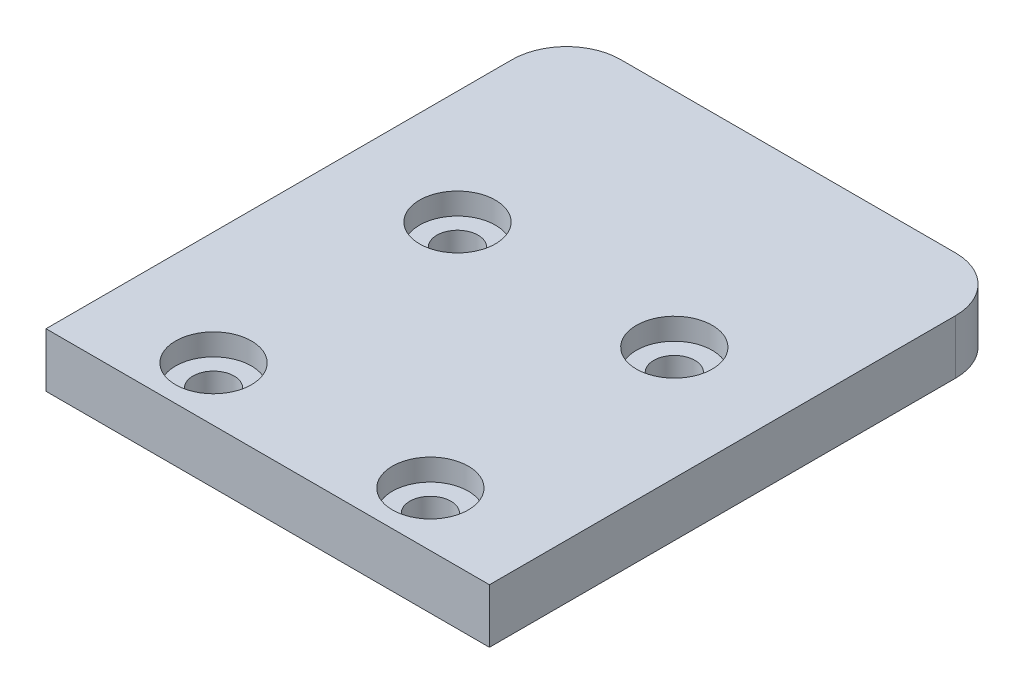
ISO-10303-21;
HEADER;
FILE_DESCRIPTION(('STEP AP214'),'2;1');
FILE_NAME('part.step','',(''),(''),'','','');
FILE_SCHEMA(('AUTOMOTIVE_DESIGN { 1 0 10303 214 1 1 1 1 }'));
ENDSEC;
DATA;
#1=APPLICATION_CONTEXT('core data for automotive mechanical design processes');
#2=APPLICATION_PROTOCOL_DEFINITION('international standard','automotive_design',2000,#1);
#3=PRODUCT_CONTEXT('',#1,'mechanical');
#4=PRODUCT('Part','Part','',(#3));
#5=PRODUCT_RELATED_PRODUCT_CATEGORY('part','',(#4));
#6=PRODUCT_DEFINITION_FORMATION('','',#4);
#7=PRODUCT_DEFINITION_CONTEXT('part definition',#1,'design');
#8=PRODUCT_DEFINITION('design','',#6,#7);
#9=PRODUCT_DEFINITION_SHAPE('','',#8);
#10=(LENGTH_UNIT() NAMED_UNIT(*) SI_UNIT(.MILLI.,.METRE.));
#11=(NAMED_UNIT(*) PLANE_ANGLE_UNIT() SI_UNIT($,.RADIAN.));
#12=(NAMED_UNIT(*) SI_UNIT($,.STERADIAN.) SOLID_ANGLE_UNIT());
#13=UNCERTAINTY_MEASURE_WITH_UNIT(LENGTH_MEASURE(1.E-05),#10,'distance_accuracy_value','');
#14=(GEOMETRIC_REPRESENTATION_CONTEXT(3) GLOBAL_UNCERTAINTY_ASSIGNED_CONTEXT((#13)) GLOBAL_UNIT_ASSIGNED_CONTEXT((#10,
#11,#12)) REPRESENTATION_CONTEXT('',''));
#15=CARTESIAN_POINT('',(0.,0.,0.));
#16=DIRECTION('',(0.,0.,1.));
#17=DIRECTION('',(1.,0.,0.));
#18=AXIS2_PLACEMENT_3D('',#15,#16,#17);
#19=CARTESIAN_POINT('',(10.45,-5.,4.5));
#20=DIRECTION('',(0.,1.,0.));
#21=DIRECTION('',(-1.,0.,0.));
#22=AXIS2_PLACEMENT_3D('',#19,#20,#21);
#23=CYLINDRICAL_SURFACE('',#22,1.9);
#24=CARTESIAN_POINT('',(10.45,0.,4.5));
#25=DIRECTION('',(0.,-1.,0.));
#26=DIRECTION('',(1.,0.,0.));
#27=AXIS2_PLACEMENT_3D('',#24,#25,#26);
#28=CIRCLE('',#27,1.9);
#29=CARTESIAN_POINT('',(12.35,0.,4.5));
#30=VERTEX_POINT('',#29);
#31=EDGE_CURVE('E149',#30,#30,#28,.T.);
#32=ORIENTED_EDGE('',*,*,#31,.T.);
#33=EDGE_LOOP('',(#32));
#34=FACE_BOUND('',#33,.T.);
#35=CARTESIAN_POINT('',(10.45,3.,4.5));
#36=DIRECTION('',(0.,1.,0.));
#37=DIRECTION('',(-1.,0.,0.));
#38=AXIS2_PLACEMENT_3D('',#35,#36,#37);
#39=CIRCLE('',#38,1.9);
#40=CARTESIAN_POINT('',(8.54999999999999,3.,4.5));
#41=VERTEX_POINT('',#40);
#42=EDGE_CURVE('E49',#41,#41,#39,.F.);
#43=ORIENTED_EDGE('',*,*,#42,.F.);
#44=EDGE_LOOP('',(#43));
#45=FACE_BOUND('',#44,.T.);
#46=ADVANCED_FACE('F45',(#34,#45),#23,.F.);
#47=CARTESIAN_POINT('',(30.45,-5.00000000000001,27.));
#48=DIRECTION('',(0.,1.,0.));
#49=DIRECTION('',(-1.,0.,0.));
#50=AXIS2_PLACEMENT_3D('',#47,#48,#49);
#51=CYLINDRICAL_SURFACE('',#50,1.9);
#52=CARTESIAN_POINT('',(30.45,0.,27.));
#53=DIRECTION('',(0.,-1.,0.));
#54=DIRECTION('',(1.,0.,0.));
#55=AXIS2_PLACEMENT_3D('',#52,#53,#54);
#56=CIRCLE('',#55,1.9);
#57=CARTESIAN_POINT('',(32.35,0.,27.));
#58=VERTEX_POINT('',#57);
#59=EDGE_CURVE('E153',#58,#58,#56,.T.);
#60=ORIENTED_EDGE('',*,*,#59,.T.);
#61=EDGE_LOOP('',(#60));
#62=FACE_BOUND('',#61,.T.);
#63=CARTESIAN_POINT('',(30.45,2.99999999999999,27.));
#64=DIRECTION('',(0.,1.,0.));
#65=DIRECTION('',(-1.,0.,0.));
#66=AXIS2_PLACEMENT_3D('',#63,#64,#65);
#67=CIRCLE('',#66,1.9);
#68=CARTESIAN_POINT('',(28.55,3.,27.));
#69=VERTEX_POINT('',#68);
#70=EDGE_CURVE('E191',#69,#69,#67,.F.);
#71=ORIENTED_EDGE('',*,*,#70,.F.);
#72=EDGE_LOOP('',(#71));
#73=FACE_BOUND('',#72,.T.);
#74=ADVANCED_FACE('F203',(#62,#73),#51,.F.);
#75=CARTESIAN_POINT('',(10.45,-5.,27.));
#76=DIRECTION('',(0.,1.,0.));
#77=DIRECTION('',(-1.,0.,0.));
#78=AXIS2_PLACEMENT_3D('',#75,#76,#77);
#79=CYLINDRICAL_SURFACE('',#78,1.9);
#80=CARTESIAN_POINT('',(10.45,0.,27.));
#81=DIRECTION('',(0.,-1.,0.));
#82=DIRECTION('',(1.,0.,0.));
#83=AXIS2_PLACEMENT_3D('',#80,#81,#82);
#84=CIRCLE('',#83,1.9);
#85=CARTESIAN_POINT('',(12.35,0.,27.));
#86=VERTEX_POINT('',#85);
#87=EDGE_CURVE('E157',#86,#86,#84,.T.);
#88=ORIENTED_EDGE('',*,*,#87,.T.);
#89=EDGE_LOOP('',(#88));
#90=FACE_BOUND('',#89,.T.);
#91=CARTESIAN_POINT('',(10.45,3.,27.));
#92=DIRECTION('',(0.,1.,0.));
#93=DIRECTION('',(-1.,0.,0.));
#94=AXIS2_PLACEMENT_3D('',#91,#92,#93);
#95=CIRCLE('',#94,1.9);
#96=CARTESIAN_POINT('',(8.55,3.,27.));
#97=VERTEX_POINT('',#96);
#98=EDGE_CURVE('E187',#97,#97,#95,.F.);
#99=ORIENTED_EDGE('',*,*,#98,.F.);
#100=EDGE_LOOP('',(#99));
#101=FACE_BOUND('',#100,.T.);
#102=ADVANCED_FACE('F209',(#90,#101),#79,.F.);
#103=CARTESIAN_POINT('',(30.45,-5.00000000000001,4.5));
#104=DIRECTION('',(0.,1.,0.));
#105=DIRECTION('',(-1.,0.,0.));
#106=AXIS2_PLACEMENT_3D('',#103,#104,#105);
#107=CYLINDRICAL_SURFACE('',#106,1.9);
#108=CARTESIAN_POINT('',(30.45,0.,4.5));
#109=DIRECTION('',(0.,-1.,0.));
#110=DIRECTION('',(1.,0.,0.));
#111=AXIS2_PLACEMENT_3D('',#108,#109,#110);
#112=CIRCLE('',#111,1.9);
#113=CARTESIAN_POINT('',(32.35,0.,4.5));
#114=VERTEX_POINT('',#113);
#115=EDGE_CURVE('E125',#114,#114,#112,.T.);
#116=ORIENTED_EDGE('',*,*,#115,.T.);
#117=EDGE_LOOP('',(#116));
#118=FACE_BOUND('',#117,.T.);
#119=CARTESIAN_POINT('',(30.45,2.99999999999999,4.5));
#120=DIRECTION('',(0.,1.,0.));
#121=DIRECTION('',(-1.,0.,0.));
#122=AXIS2_PLACEMENT_3D('',#119,#120,#121);
#123=CIRCLE('',#122,1.9);
#124=CARTESIAN_POINT('',(28.55,3.,4.5));
#125=VERTEX_POINT('',#124);
#126=EDGE_CURVE('E183',#125,#125,#123,.F.);
#127=ORIENTED_EDGE('',*,*,#126,.F.);
#128=EDGE_LOOP('',(#127));
#129=FACE_BOUND('',#128,.T.);
#130=ADVANCED_FACE('F230',(#118,#129),#107,.F.);
#131=CARTESIAN_POINT('',(0.,5.,-9.));
#132=DIRECTION('',(0.,-1.,0.));
#133=DIRECTION('',(1.,0.,0.));
#134=AXIS2_PLACEMENT_3D('',#131,#132,#133);
#135=PLANE('',#134);
#136=CARTESIAN_POINT('',(10.45,5.,27.));
#137=DIRECTION('',(0.,1.,0.));
#138=DIRECTION('',(-1.,0.,0.));
#139=AXIS2_PLACEMENT_3D('',#136,#137,#138);
#140=CIRCLE('',#139,3.5);
#141=CARTESIAN_POINT('',(6.95,5.,27.));
#142=VERTEX_POINT('',#141);
#143=EDGE_CURVE('E259',#142,#142,#140,.T.);
#144=ORIENTED_EDGE('',*,*,#143,.F.);
#145=EDGE_LOOP('',(#144));
#146=FACE_BOUND('',#145,.T.);
#147=CARTESIAN_POINT('',(30.45,4.99999999999999,27.));
#148=DIRECTION('',(0.,1.,0.));
#149=DIRECTION('',(-1.,0.,0.));
#150=AXIS2_PLACEMENT_3D('',#147,#148,#149);
#151=CIRCLE('',#150,3.5);
#152=CARTESIAN_POINT('',(26.95,5.,27.));
#153=VERTEX_POINT('',#152);
#154=EDGE_CURVE('E267',#153,#153,#151,.T.);
#155=ORIENTED_EDGE('',*,*,#154,.F.);
#156=EDGE_LOOP('',(#155));
#157=FACE_BOUND('',#156,.T.);
#158=CARTESIAN_POINT('',(30.45,4.99999999999999,4.5));
#159=DIRECTION('',(0.,1.,0.));
#160=DIRECTION('',(-1.,0.,0.));
#161=AXIS2_PLACEMENT_3D('',#158,#159,#160);
#162=CIRCLE('',#161,3.5);
#163=CARTESIAN_POINT('',(26.95,5.,4.5));
#164=VERTEX_POINT('',#163);
#165=EDGE_CURVE('E251',#164,#164,#162,.T.);
#166=ORIENTED_EDGE('',*,*,#165,.F.);
#167=EDGE_LOOP('',(#166));
#168=FACE_BOUND('',#167,.T.);
#169=CARTESIAN_POINT('',(10.45,5.,4.5));
#170=DIRECTION('',(0.,1.,0.));
#171=DIRECTION('',(-1.,0.,0.));
#172=AXIS2_PLACEMENT_3D('',#169,#170,#171);
#173=CIRCLE('',#172,3.5);
#174=CARTESIAN_POINT('',(6.94999999999999,5.,4.5));
#175=VERTEX_POINT('',#174);
#176=EDGE_CURVE('E247',#175,#175,#173,.T.);
#177=ORIENTED_EDGE('',*,*,#176,.F.);
#178=EDGE_LOOP('',(#177));
#179=FACE_BOUND('',#178,.T.);
#180=DIRECTION('',(0.,0.,1.));
#181=VECTOR('',#180,1.);
#182=CARTESIAN_POINT('',(40.9,5.,-9.));
#183=LINE('',#182,#181);
#184=CARTESIAN_POINT('',(40.9,5.,-11.));
#185=VERTEX_POINT('',#184);
#186=CARTESIAN_POINT('',(40.9,4.99999999999999,32.));
#187=VERTEX_POINT('',#186);
#188=EDGE_CURVE('E102',#185,#187,#183,.T.);
#189=ORIENTED_EDGE('',*,*,#188,.F.);
#190=CARTESIAN_POINT('',(35.9,4.99999999999999,-11.));
#191=DIRECTION('',(0.,-1.,0.));
#192=DIRECTION('',(1.,0.,0.));
#193=AXIS2_PLACEMENT_3D('',#190,#191,#192);
#194=CIRCLE('',#193,5.);
#195=CARTESIAN_POINT('',(35.9,4.99999999999999,-16.));
#196=VERTEX_POINT('',#195);
#197=EDGE_CURVE('E169',#185,#196,#194,.F.);
#198=ORIENTED_EDGE('',*,*,#197,.T.);
#199=DIRECTION('',(-1.,0.,0.));
#200=VECTOR('',#199,1.);
#201=CARTESIAN_POINT('',(0.,5.,-16.));
#202=LINE('',#201,#200);
#203=CARTESIAN_POINT('',(5.00000000000001,5.,-16.));
#204=VERTEX_POINT('',#203);
#205=EDGE_CURVE('E130',#196,#204,#202,.T.);
#206=ORIENTED_EDGE('',*,*,#205,.T.);
#207=CARTESIAN_POINT('',(5.00000000000001,5.,-11.));
#208=DIRECTION('',(0.,-1.,0.));
#209=DIRECTION('',(1.,0.,0.));
#210=AXIS2_PLACEMENT_3D('',#207,#208,#209);
#211=CIRCLE('',#210,5.);
#212=CARTESIAN_POINT('',(0.,5.,-11.));
#213=VERTEX_POINT('',#212);
#214=EDGE_CURVE('E166',#204,#213,#211,.F.);
#215=ORIENTED_EDGE('',*,*,#214,.T.);
#216=DIRECTION('',(0.,0.,1.));
#217=VECTOR('',#216,1.);
#218=CARTESIAN_POINT('',(0.,5.,-9.));
#219=LINE('',#218,#217);
#220=CARTESIAN_POINT('',(0.,5.,32.));
#221=VERTEX_POINT('',#220);
#222=EDGE_CURVE('E113',#213,#221,#219,.T.);
#223=ORIENTED_EDGE('',*,*,#222,.T.);
#224=DIRECTION('',(1.,0.,0.));
#225=VECTOR('',#224,1.);
#226=CARTESIAN_POINT('',(0.,5.,32.));
#227=LINE('',#226,#225);
#228=EDGE_CURVE('E120',#221,#187,#227,.T.);
#229=ORIENTED_EDGE('',*,*,#228,.T.);
#230=EDGE_LOOP('',(#189,#198,#206,#215,#223,#229));
#231=FACE_BOUND('',#230,.T.);
#232=ADVANCED_FACE('F127',(#146,#157,#168,#179,#231),#135,.F.);
#233=CARTESIAN_POINT('',(0.,0.,-9.));
#234=DIRECTION('',(0.,-1.,0.));
#235=DIRECTION('',(1.,0.,0.));
#236=AXIS2_PLACEMENT_3D('',#233,#234,#235);
#237=PLANE('',#236);
#238=ORIENTED_EDGE('',*,*,#115,.F.);
#239=EDGE_LOOP('',(#238));
#240=FACE_BOUND('',#239,.T.);
#241=ORIENTED_EDGE('',*,*,#87,.F.);
#242=EDGE_LOOP('',(#241));
#243=FACE_BOUND('',#242,.T.);
#244=ORIENTED_EDGE('',*,*,#59,.F.);
#245=EDGE_LOOP('',(#244));
#246=FACE_BOUND('',#245,.T.);
#247=ORIENTED_EDGE('',*,*,#31,.F.);
#248=EDGE_LOOP('',(#247));
#249=FACE_BOUND('',#248,.T.);
#250=DIRECTION('',(-1.,0.,0.));
#251=VECTOR('',#250,1.);
#252=CARTESIAN_POINT('',(0.,0.,-16.));
#253=LINE('',#252,#251);
#254=CARTESIAN_POINT('',(35.9,0.,-16.));
#255=VERTEX_POINT('',#254);
#256=CARTESIAN_POINT('',(5.00000000000001,0.,-16.));
#257=VERTEX_POINT('',#256);
#258=EDGE_CURVE('E114',#255,#257,#253,.T.);
#259=ORIENTED_EDGE('',*,*,#258,.F.);
#260=CARTESIAN_POINT('',(35.9,0.,-11.));
#261=DIRECTION('',(0.,-1.,0.));
#262=DIRECTION('',(1.,0.,0.));
#263=AXIS2_PLACEMENT_3D('',#260,#261,#262);
#264=CIRCLE('',#263,5.);
#265=CARTESIAN_POINT('',(40.9,0.,-11.));
#266=VERTEX_POINT('',#265);
#267=EDGE_CURVE('E55',#255,#266,#264,.T.);
#268=ORIENTED_EDGE('',*,*,#267,.T.);
#269=DIRECTION('',(0.,0.,-1.));
#270=VECTOR('',#269,1.);
#271=CARTESIAN_POINT('',(40.9,0.,-9.));
#272=LINE('',#271,#270);
#273=CARTESIAN_POINT('',(40.9,0.,32.));
#274=VERTEX_POINT('',#273);
#275=EDGE_CURVE('E142',#274,#266,#272,.T.);
#276=ORIENTED_EDGE('',*,*,#275,.F.);
#277=DIRECTION('',(1.,0.,0.));
#278=VECTOR('',#277,1.);
#279=CARTESIAN_POINT('',(0.,0.,32.));
#280=LINE('',#279,#278);
#281=CARTESIAN_POINT('',(0.,0.,32.));
#282=VERTEX_POINT('',#281);
#283=EDGE_CURVE('E122',#282,#274,#280,.T.);
#284=ORIENTED_EDGE('',*,*,#283,.F.);
#285=DIRECTION('',(0.,0.,1.));
#286=VECTOR('',#285,1.);
#287=CARTESIAN_POINT('',(0.,0.,-9.));
#288=LINE('',#287,#286);
#289=CARTESIAN_POINT('',(0.,0.,-11.));
#290=VERTEX_POINT('',#289);
#291=EDGE_CURVE('E135',#290,#282,#288,.T.);
#292=ORIENTED_EDGE('',*,*,#291,.F.);
#293=CARTESIAN_POINT('',(5.00000000000001,0.,-11.));
#294=DIRECTION('',(0.,-1.,0.));
#295=DIRECTION('',(1.,0.,0.));
#296=AXIS2_PLACEMENT_3D('',#293,#294,#295);
#297=CIRCLE('',#296,5.);
#298=EDGE_CURVE('E68',#290,#257,#297,.T.);
#299=ORIENTED_EDGE('',*,*,#298,.T.);
#300=EDGE_LOOP('',(#259,#268,#276,#284,#292,#299));
#301=FACE_BOUND('',#300,.T.);
#302=ADVANCED_FACE('F227',(#240,#243,#246,#249,#301),#237,.T.);
#303=CARTESIAN_POINT('',(0.,0.,-9.));
#304=DIRECTION('',(-1.,0.,0.));
#305=DIRECTION('',(0.,0.,1.));
#306=AXIS2_PLACEMENT_3D('',#303,#304,#305);
#307=PLANE('',#306);
#308=ORIENTED_EDGE('',*,*,#222,.F.);
#309=DIRECTION('',(0.,1.,0.));
#310=VECTOR('',#309,1.);
#311=CARTESIAN_POINT('',(0.,0.,-11.));
#312=LINE('',#311,#310);
#313=EDGE_CURVE('E11',#213,#290,#312,.F.);
#314=ORIENTED_EDGE('',*,*,#313,.T.);
#315=ORIENTED_EDGE('',*,*,#291,.T.);
#316=DIRECTION('',(0.,1.,0.));
#317=VECTOR('',#316,1.);
#318=CARTESIAN_POINT('',(0.,0.,32.));
#319=LINE('',#318,#317);
#320=EDGE_CURVE('E124',#282,#221,#319,.T.);
#321=ORIENTED_EDGE('',*,*,#320,.T.);
#322=EDGE_LOOP('',(#308,#314,#315,#321));
#323=FACE_BOUND('',#322,.T.);
#324=ADVANCED_FACE('F221',(#323),#307,.T.);
#325=CARTESIAN_POINT('',(0.,0.,-16.));
#326=DIRECTION('',(0.,0.,-1.));
#327=DIRECTION('',(-1.,0.,0.));
#328=AXIS2_PLACEMENT_3D('',#325,#326,#327);
#329=PLANE('',#328);
#330=ORIENTED_EDGE('',*,*,#205,.F.);
#331=DIRECTION('',(0.,1.,0.));
#332=VECTOR('',#331,1.);
#333=CARTESIAN_POINT('',(35.9,0.,-16.));
#334=LINE('',#333,#332);
#335=EDGE_CURVE('E176',#196,#255,#334,.F.);
#336=ORIENTED_EDGE('',*,*,#335,.T.);
#337=ORIENTED_EDGE('',*,*,#258,.T.);
#338=DIRECTION('',(0.,1.,0.));
#339=VECTOR('',#338,1.);
#340=CARTESIAN_POINT('',(5.00000000000001,0.,-16.));
#341=LINE('',#340,#339);
#342=EDGE_CURVE('E172',#257,#204,#341,.T.);
#343=ORIENTED_EDGE('',*,*,#342,.T.);
#344=EDGE_LOOP('',(#330,#336,#337,#343));
#345=FACE_BOUND('',#344,.T.);
#346=ADVANCED_FACE('F218',(#345),#329,.T.);
#347=CARTESIAN_POINT('',(40.9,0.,-9.));
#348=DIRECTION('',(1.,0.,0.));
#349=DIRECTION('',(0.,1.,0.));
#350=AXIS2_PLACEMENT_3D('',#347,#348,#349);
#351=PLANE('',#350);
#352=ORIENTED_EDGE('',*,*,#275,.T.);
#353=DIRECTION('',(0.,1.,0.));
#354=VECTOR('',#353,1.);
#355=CARTESIAN_POINT('',(40.9,0.,-11.));
#356=LINE('',#355,#354);
#357=EDGE_CURVE('E109',#266,#185,#356,.T.);
#358=ORIENTED_EDGE('',*,*,#357,.T.);
#359=ORIENTED_EDGE('',*,*,#188,.T.);
#360=DIRECTION('',(0.,1.,0.));
#361=VECTOR('',#360,1.);
#362=CARTESIAN_POINT('',(40.9,0.,32.));
#363=LINE('',#362,#361);
#364=EDGE_CURVE('E106',#274,#187,#363,.T.);
#365=ORIENTED_EDGE('',*,*,#364,.F.);
#366=EDGE_LOOP('',(#352,#358,#359,#365));
#367=FACE_BOUND('',#366,.T.);
#368=ADVANCED_FACE('F105',(#367),#351,.T.);
#369=CARTESIAN_POINT('',(0.,0.,32.));
#370=DIRECTION('',(0.,0.,1.));
#371=DIRECTION('',(1.,0.,0.));
#372=AXIS2_PLACEMENT_3D('',#369,#370,#371);
#373=PLANE('',#372);
#374=ORIENTED_EDGE('',*,*,#228,.F.);
#375=ORIENTED_EDGE('',*,*,#320,.F.);
#376=ORIENTED_EDGE('',*,*,#283,.T.);
#377=ORIENTED_EDGE('',*,*,#364,.T.);
#378=EDGE_LOOP('',(#374,#375,#376,#377));
#379=FACE_BOUND('',#378,.T.);
#380=ADVANCED_FACE('F118',(#379),#373,.T.);
#381=CARTESIAN_POINT('',(35.9,0.,-11.));
#382=DIRECTION('',(0.,1.,0.));
#383=DIRECTION('',(-1.,0.,0.));
#384=AXIS2_PLACEMENT_3D('',#381,#382,#383);
#385=CYLINDRICAL_SURFACE('',#384,5.);
#386=ORIENTED_EDGE('',*,*,#267,.F.);
#387=ORIENTED_EDGE('',*,*,#335,.F.);
#388=ORIENTED_EDGE('',*,*,#197,.F.);
#389=ORIENTED_EDGE('',*,*,#357,.F.);
#390=EDGE_LOOP('',(#386,#387,#388,#389));
#391=FACE_BOUND('',#390,.T.);
#392=ADVANCED_FACE('F217',(#391),#385,.T.);
#393=CARTESIAN_POINT('',(5.00000000000001,0.,-11.));
#394=DIRECTION('',(0.,1.,0.));
#395=DIRECTION('',(-1.,0.,0.));
#396=AXIS2_PLACEMENT_3D('',#393,#394,#395);
#397=CYLINDRICAL_SURFACE('',#396,5.);
#398=ORIENTED_EDGE('',*,*,#298,.F.);
#399=ORIENTED_EDGE('',*,*,#313,.F.);
#400=ORIENTED_EDGE('',*,*,#214,.F.);
#401=ORIENTED_EDGE('',*,*,#342,.F.);
#402=EDGE_LOOP('',(#398,#399,#400,#401));
#403=FACE_BOUND('',#402,.T.);
#404=ADVANCED_FACE('F47',(#403),#397,.T.);
#405=CARTESIAN_POINT('',(30.45,2.99999999999999,4.5));
#406=DIRECTION('',(0.,1.,0.));
#407=DIRECTION('',(-1.,0.,0.));
#408=AXIS2_PLACEMENT_3D('',#405,#406,#407);
#409=PLANE('',#408);
#410=CARTESIAN_POINT('',(30.45,2.99999999999999,4.5));
#411=DIRECTION('',(0.,1.,0.));
#412=DIRECTION('',(-1.,0.,0.));
#413=AXIS2_PLACEMENT_3D('',#410,#411,#412);
#414=CIRCLE('',#413,3.5);
#415=CARTESIAN_POINT('',(26.95,3.,4.5));
#416=VERTEX_POINT('',#415);
#417=EDGE_CURVE('E271',#416,#416,#414,.T.);
#418=ORIENTED_EDGE('',*,*,#417,.T.);
#419=EDGE_LOOP('',(#418));
#420=FACE_BOUND('',#419,.T.);
#421=ORIENTED_EDGE('',*,*,#126,.T.);
#422=EDGE_LOOP('',(#421));
#423=FACE_BOUND('',#422,.T.);
#424=ADVANCED_FACE('F239',(#420,#423),#409,.T.);
#425=CARTESIAN_POINT('',(30.45,2.99999999999999,4.5));
#426=DIRECTION('',(0.,1.,0.));
#427=DIRECTION('',(-1.,0.,0.));
#428=AXIS2_PLACEMENT_3D('',#425,#426,#427);
#429=CYLINDRICAL_SURFACE('',#428,3.5);
#430=ORIENTED_EDGE('',*,*,#417,.F.);
#431=EDGE_LOOP('',(#430));
#432=FACE_BOUND('',#431,.T.);
#433=ORIENTED_EDGE('',*,*,#165,.T.);
#434=EDGE_LOOP('',(#433));
#435=FACE_BOUND('',#434,.T.);
#436=ADVANCED_FACE('F279',(#432,#435),#429,.F.);
#437=CARTESIAN_POINT('',(10.45,3.,27.));
#438=DIRECTION('',(0.,1.,0.));
#439=DIRECTION('',(-1.,0.,0.));
#440=AXIS2_PLACEMENT_3D('',#437,#438,#439);
#441=PLANE('',#440);
#442=CARTESIAN_POINT('',(10.45,3.,27.));
#443=DIRECTION('',(0.,1.,0.));
#444=DIRECTION('',(-1.,0.,0.));
#445=AXIS2_PLACEMENT_3D('',#442,#443,#444);
#446=CIRCLE('',#445,3.5);
#447=CARTESIAN_POINT('',(6.95,3.,27.));
#448=VERTEX_POINT('',#447);
#449=EDGE_CURVE('E255',#448,#448,#446,.T.);
#450=ORIENTED_EDGE('',*,*,#449,.T.);
#451=EDGE_LOOP('',(#450));
#452=FACE_BOUND('',#451,.T.);
#453=ORIENTED_EDGE('',*,*,#98,.T.);
#454=EDGE_LOOP('',(#453));
#455=FACE_BOUND('',#454,.T.);
#456=ADVANCED_FACE('F312',(#452,#455),#441,.T.);
#457=CARTESIAN_POINT('',(10.45,3.,27.));
#458=DIRECTION('',(0.,1.,0.));
#459=DIRECTION('',(-1.,0.,0.));
#460=AXIS2_PLACEMENT_3D('',#457,#458,#459);
#461=CYLINDRICAL_SURFACE('',#460,3.5);
#462=ORIENTED_EDGE('',*,*,#449,.F.);
#463=EDGE_LOOP('',(#462));
#464=FACE_BOUND('',#463,.T.);
#465=ORIENTED_EDGE('',*,*,#143,.T.);
#466=EDGE_LOOP('',(#465));
#467=FACE_BOUND('',#466,.T.);
#468=ADVANCED_FACE('F322',(#464,#467),#461,.F.);
#469=CARTESIAN_POINT('',(30.45,2.99999999999999,27.));
#470=DIRECTION('',(0.,1.,0.));
#471=DIRECTION('',(-1.,0.,0.));
#472=AXIS2_PLACEMENT_3D('',#469,#470,#471);
#473=PLANE('',#472);
#474=CARTESIAN_POINT('',(30.45,2.99999999999999,27.));
#475=DIRECTION('',(0.,1.,0.));
#476=DIRECTION('',(-1.,0.,0.));
#477=AXIS2_PLACEMENT_3D('',#474,#475,#476);
#478=CIRCLE('',#477,3.5);
#479=CARTESIAN_POINT('',(26.95,3.,27.));
#480=VERTEX_POINT('',#479);
#481=EDGE_CURVE('E263',#480,#480,#478,.T.);
#482=ORIENTED_EDGE('',*,*,#481,.T.);
#483=EDGE_LOOP('',(#482));
#484=FACE_BOUND('',#483,.T.);
#485=ORIENTED_EDGE('',*,*,#70,.T.);
#486=EDGE_LOOP('',(#485));
#487=FACE_BOUND('',#486,.T.);
#488=ADVANCED_FACE('F318',(#484,#487),#473,.T.);
#489=CARTESIAN_POINT('',(30.45,2.99999999999999,27.));
#490=DIRECTION('',(0.,1.,0.));
#491=DIRECTION('',(-1.,0.,0.));
#492=AXIS2_PLACEMENT_3D('',#489,#490,#491);
#493=CYLINDRICAL_SURFACE('',#492,3.5);
#494=ORIENTED_EDGE('',*,*,#481,.F.);
#495=EDGE_LOOP('',(#494));
#496=FACE_BOUND('',#495,.T.);
#497=ORIENTED_EDGE('',*,*,#154,.T.);
#498=EDGE_LOOP('',(#497));
#499=FACE_BOUND('',#498,.T.);
#500=ADVANCED_FACE('F291',(#496,#499),#493,.F.);
#501=CARTESIAN_POINT('',(10.45,3.,4.5));
#502=DIRECTION('',(0.,1.,0.));
#503=DIRECTION('',(-1.,0.,0.));
#504=AXIS2_PLACEMENT_3D('',#501,#502,#503);
#505=PLANE('',#504);
#506=CARTESIAN_POINT('',(10.45,3.,4.5));
#507=DIRECTION('',(0.,1.,0.));
#508=DIRECTION('',(-1.,0.,0.));
#509=AXIS2_PLACEMENT_3D('',#506,#507,#508);
#510=CIRCLE('',#509,3.5);
#511=CARTESIAN_POINT('',(6.94999999999999,3.,4.5));
#512=VERTEX_POINT('',#511);
#513=EDGE_CURVE('E188',#512,#512,#510,.T.);
#514=ORIENTED_EDGE('',*,*,#513,.T.);
#515=EDGE_LOOP('',(#514));
#516=FACE_BOUND('',#515,.T.);
#517=ORIENTED_EDGE('',*,*,#42,.T.);
#518=EDGE_LOOP('',(#517));
#519=FACE_BOUND('',#518,.T.);
#520=ADVANCED_FACE('F200',(#516,#519),#505,.T.);
#521=CARTESIAN_POINT('',(10.45,3.,4.5));
#522=DIRECTION('',(0.,1.,0.));
#523=DIRECTION('',(-1.,0.,0.));
#524=AXIS2_PLACEMENT_3D('',#521,#522,#523);
#525=CYLINDRICAL_SURFACE('',#524,3.5);
#526=ORIENTED_EDGE('',*,*,#513,.F.);
#527=EDGE_LOOP('',(#526));
#528=FACE_BOUND('',#527,.T.);
#529=ORIENTED_EDGE('',*,*,#176,.T.);
#530=EDGE_LOOP('',(#529));
#531=FACE_BOUND('',#530,.T.);
#532=ADVANCED_FACE('F284',(#528,#531),#525,.F.);
#533=CLOSED_SHELL('',(#46,#74,#102,#130,#232,#302,#324,#346,#368,#380,#392,#404,#424,#436,#456,
#468,#488,#500,#520,#532));
#534=MANIFOLD_SOLID_BREP('B2',#533);
#535=ADVANCED_BREP_SHAPE_REPRESENTATION('',(#18,#534),#14);
#536=SHAPE_DEFINITION_REPRESENTATION(#9,#535);
ENDSEC;
END-ISO-10303-21;
